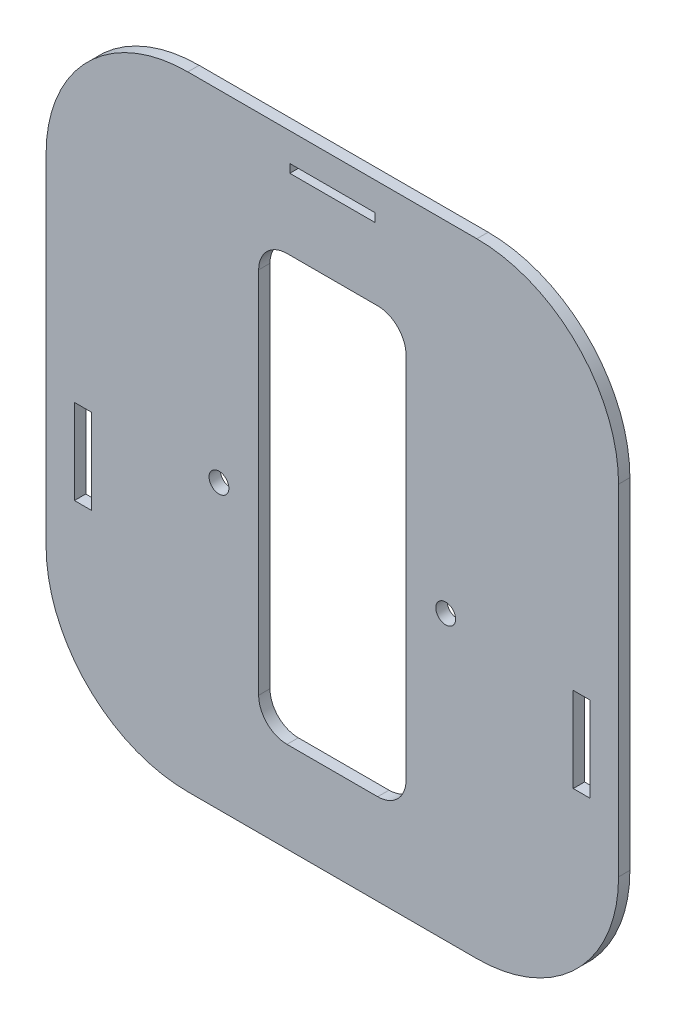
ISO-10303-21;
HEADER;
FILE_DESCRIPTION(('STEP AP214'),'2;1');
FILE_NAME('part.step','',(''),(''),'','','');
FILE_SCHEMA(('AUTOMOTIVE_DESIGN { 1 0 10303 214 1 1 1 1 }'));
ENDSEC;
DATA;
#1=APPLICATION_CONTEXT('core data for automotive mechanical design processes');
#2=APPLICATION_PROTOCOL_DEFINITION('international standard','automotive_design',2000,#1);
#3=PRODUCT_CONTEXT('',#1,'mechanical');
#4=PRODUCT('Part','Part','',(#3));
#5=PRODUCT_RELATED_PRODUCT_CATEGORY('part','',(#4));
#6=PRODUCT_DEFINITION_FORMATION('','',#4);
#7=PRODUCT_DEFINITION_CONTEXT('part definition',#1,'design');
#8=PRODUCT_DEFINITION('design','',#6,#7);
#9=PRODUCT_DEFINITION_SHAPE('','',#8);
#10=(LENGTH_UNIT() NAMED_UNIT(*) SI_UNIT(.MILLI.,.METRE.));
#11=(NAMED_UNIT(*) PLANE_ANGLE_UNIT() SI_UNIT($,.RADIAN.));
#12=(NAMED_UNIT(*) SI_UNIT($,.STERADIAN.) SOLID_ANGLE_UNIT());
#13=UNCERTAINTY_MEASURE_WITH_UNIT(LENGTH_MEASURE(1.E-05),#10,'distance_accuracy_value','');
#14=(GEOMETRIC_REPRESENTATION_CONTEXT(3) GLOBAL_UNCERTAINTY_ASSIGNED_CONTEXT((#13)) GLOBAL_UNIT_ASSIGNED_CONTEXT((#10,
#11,#12)) REPRESENTATION_CONTEXT('',''));
#15=CARTESIAN_POINT('',(0.,0.,0.));
#16=DIRECTION('',(0.,0.,1.));
#17=DIRECTION('',(1.,0.,0.));
#18=AXIS2_PLACEMENT_3D('',#15,#16,#17);
#19=CARTESIAN_POINT('',(-8.,87.1,2.));
#20=DIRECTION('',(1.,0.,0.));
#21=DIRECTION('',(0.,1.,0.));
#22=AXIS2_PLACEMENT_3D('',#19,#20,#21);
#23=PLANE('',#22);
#24=DIRECTION('',(0.,-1.,0.));
#25=VECTOR('',#24,1.);
#26=CARTESIAN_POINT('',(-8.,87.1,0.));
#27=LINE('',#26,#25);
#28=CARTESIAN_POINT('',(-8.,62.1,0.));
#29=VERTEX_POINT('',#28);
#30=CARTESIAN_POINT('',(-7.99999999999999,2.09999999999999,0.));
#31=VERTEX_POINT('',#30);
#32=EDGE_CURVE('E326',#29,#31,#27,.T.);
#33=ORIENTED_EDGE('',*,*,#32,.T.);
#34=DIRECTION('',(0.,0.,-1.));
#35=VECTOR('',#34,1.);
#36=CARTESIAN_POINT('',(-7.99999999999999,2.09999999999999,2.));
#37=LINE('',#36,#35);
#38=CARTESIAN_POINT('',(-7.99999999999999,2.09999999999999,2.));
#39=VERTEX_POINT('',#38);
#40=EDGE_CURVE('E390',#31,#39,#37,.F.);
#41=ORIENTED_EDGE('',*,*,#40,.T.);
#42=DIRECTION('',(0.,-1.,0.));
#43=VECTOR('',#42,1.);
#44=CARTESIAN_POINT('',(-8.,87.1,2.));
#45=LINE('',#44,#43);
#46=CARTESIAN_POINT('',(-8.,62.1,2.));
#47=VERTEX_POINT('',#46);
#48=EDGE_CURVE('E333',#47,#39,#45,.T.);
#49=ORIENTED_EDGE('',*,*,#48,.F.);
#50=DIRECTION('',(0.,0.,-1.));
#51=VECTOR('',#50,1.);
#52=CARTESIAN_POINT('',(-8.,62.1,2.));
#53=LINE('',#52,#51);
#54=EDGE_CURVE('E387',#47,#29,#53,.T.);
#55=ORIENTED_EDGE('',*,*,#54,.T.);
#56=EDGE_LOOP('',(#33,#41,#49,#55));
#57=FACE_BOUND('',#56,.T.);
#58=ADVANCED_FACE('F33',(#57),#23,.F.);
#59=CARTESIAN_POINT('',(-7.99999999999998,-22.9,2.));
#60=DIRECTION('',(0.,1.,0.));
#61=DIRECTION('',(0.,0.,1.));
#62=AXIS2_PLACEMENT_3D('',#59,#60,#61);
#63=PLANE('',#62);
#64=DIRECTION('',(1.,0.,0.));
#65=VECTOR('',#64,1.);
#66=CARTESIAN_POINT('',(-7.99999999999998,-22.9,0.));
#67=LINE('',#66,#65);
#68=CARTESIAN_POINT('',(17.,-22.9,0.));
#69=VERTEX_POINT('',#68);
#70=CARTESIAN_POINT('',(68.,-22.9,0.));
#71=VERTEX_POINT('',#70);
#72=EDGE_CURVE('E349',#69,#71,#67,.T.);
#73=ORIENTED_EDGE('',*,*,#72,.T.);
#74=DIRECTION('',(0.,0.,-1.));
#75=VECTOR('',#74,1.);
#76=CARTESIAN_POINT('',(68.,-22.9,2.));
#77=LINE('',#76,#75);
#78=CARTESIAN_POINT('',(68.,-22.9,2.));
#79=VERTEX_POINT('',#78);
#80=EDGE_CURVE('E385',#71,#79,#77,.F.);
#81=ORIENTED_EDGE('',*,*,#80,.T.);
#82=DIRECTION('',(1.,0.,0.));
#83=VECTOR('',#82,1.);
#84=CARTESIAN_POINT('',(-7.99999999999998,-22.9,2.));
#85=LINE('',#84,#83);
#86=CARTESIAN_POINT('',(17.,-22.9,2.));
#87=VERTEX_POINT('',#86);
#88=EDGE_CURVE('E336',#87,#79,#85,.T.);
#89=ORIENTED_EDGE('',*,*,#88,.F.);
#90=DIRECTION('',(0.,0.,-1.));
#91=VECTOR('',#90,1.);
#92=CARTESIAN_POINT('',(17.,-22.9,2.));
#93=LINE('',#92,#91);
#94=EDGE_CURVE('E382',#87,#69,#93,.T.);
#95=ORIENTED_EDGE('',*,*,#94,.T.);
#96=EDGE_LOOP('',(#73,#81,#89,#95));
#97=FACE_BOUND('',#96,.T.);
#98=ADVANCED_FACE('F529',(#97),#63,.F.);
#99=CARTESIAN_POINT('',(93.,87.1,2.));
#100=DIRECTION('',(-1.,0.,0.));
#101=DIRECTION('',(0.,-1.,0.));
#102=AXIS2_PLACEMENT_3D('',#99,#100,#101);
#103=PLANE('',#102);
#104=DIRECTION('',(0.,1.,0.));
#105=VECTOR('',#104,1.);
#106=CARTESIAN_POINT('',(93.,87.1,0.));
#107=LINE('',#106,#105);
#108=CARTESIAN_POINT('',(93.,2.1,0.));
#109=VERTEX_POINT('',#108);
#110=CARTESIAN_POINT('',(93.,62.1,0.));
#111=VERTEX_POINT('',#110);
#112=EDGE_CURVE('E352',#109,#111,#107,.T.);
#113=ORIENTED_EDGE('',*,*,#112,.T.);
#114=DIRECTION('',(0.,0.,-1.));
#115=VECTOR('',#114,1.);
#116=CARTESIAN_POINT('',(93.,62.1,2.));
#117=LINE('',#116,#115);
#118=CARTESIAN_POINT('',(93.,62.1,2.));
#119=VERTEX_POINT('',#118);
#120=EDGE_CURVE('E372',#111,#119,#117,.F.);
#121=ORIENTED_EDGE('',*,*,#120,.T.);
#122=DIRECTION('',(0.,1.,0.));
#123=VECTOR('',#122,1.);
#124=CARTESIAN_POINT('',(93.,87.1,2.));
#125=LINE('',#124,#123);
#126=CARTESIAN_POINT('',(93.,2.1,2.));
#127=VERTEX_POINT('',#126);
#128=EDGE_CURVE('E340',#127,#119,#125,.T.);
#129=ORIENTED_EDGE('',*,*,#128,.F.);
#130=DIRECTION('',(0.,0.,-1.));
#131=VECTOR('',#130,1.);
#132=CARTESIAN_POINT('',(93.,2.1,2.));
#133=LINE('',#132,#131);
#134=EDGE_CURVE('E369',#127,#109,#133,.T.);
#135=ORIENTED_EDGE('',*,*,#134,.T.);
#136=EDGE_LOOP('',(#113,#121,#129,#135));
#137=FACE_BOUND('',#136,.T.);
#138=ADVANCED_FACE('F533',(#137),#103,.F.);
#139=CARTESIAN_POINT('',(-8.,87.1,2.));
#140=DIRECTION('',(0.,-1.,0.));
#141=DIRECTION('',(0.,0.,-1.));
#142=AXIS2_PLACEMENT_3D('',#139,#140,#141);
#143=PLANE('',#142);
#144=DIRECTION('',(-1.,0.,0.));
#145=VECTOR('',#144,1.);
#146=CARTESIAN_POINT('',(-8.,87.1,2.));
#147=LINE('',#146,#145);
#148=CARTESIAN_POINT('',(68.,87.1,2.));
#149=VERTEX_POINT('',#148);
#150=CARTESIAN_POINT('',(17.,87.1,2.));
#151=VERTEX_POINT('',#150);
#152=EDGE_CURVE('E343',#149,#151,#147,.T.);
#153=ORIENTED_EDGE('',*,*,#152,.F.);
#154=DIRECTION('',(0.,0.,-1.));
#155=VECTOR('',#154,1.);
#156=CARTESIAN_POINT('',(68.,87.1,2.));
#157=LINE('',#156,#155);
#158=CARTESIAN_POINT('',(68.,87.1,0.));
#159=VERTEX_POINT('',#158);
#160=EDGE_CURVE('E358',#149,#159,#157,.T.);
#161=ORIENTED_EDGE('',*,*,#160,.T.);
#162=DIRECTION('',(-1.,0.,0.));
#163=VECTOR('',#162,1.);
#164=CARTESIAN_POINT('',(-8.,87.1,0.));
#165=LINE('',#164,#163);
#166=CARTESIAN_POINT('',(17.,87.1,0.));
#167=VERTEX_POINT('',#166);
#168=EDGE_CURVE('E337',#159,#167,#165,.T.);
#169=ORIENTED_EDGE('',*,*,#168,.T.);
#170=DIRECTION('',(0.,0.,-1.));
#171=VECTOR('',#170,1.);
#172=CARTESIAN_POINT('',(17.,87.1,2.));
#173=LINE('',#172,#171);
#174=EDGE_CURVE('E346',#167,#151,#173,.F.);
#175=ORIENTED_EDGE('',*,*,#174,.T.);
#176=EDGE_LOOP('',(#153,#161,#169,#175));
#177=FACE_BOUND('',#176,.T.);
#178=ADVANCED_FACE('F486',(#177),#143,.F.);
#179=CARTESIAN_POINT('',(0.,0.,2.));
#180=DIRECTION('',(0.,0.,1.));
#181=DIRECTION('',(1.,0.,0.));
#182=AXIS2_PLACEMENT_3D('',#179,#180,#181);
#183=PLANE('',#182);
#184=CARTESIAN_POINT('',(62.5,27.1,2.));
#185=DIRECTION('',(0.,0.,1.));
#186=DIRECTION('',(1.,0.,0.));
#187=AXIS2_PLACEMENT_3D('',#184,#185,#186);
#188=CIRCLE('',#187,1.75);
#189=CARTESIAN_POINT('',(64.25,27.1,2.));
#190=VERTEX_POINT('',#189);
#191=EDGE_CURVE('E436',#190,#190,#188,.T.);
#192=ORIENTED_EDGE('',*,*,#191,.F.);
#193=EDGE_LOOP('',(#192));
#194=FACE_BOUND('',#193,.T.);
#195=CARTESIAN_POINT('',(22.5,27.1,2.));
#196=DIRECTION('',(0.,0.,1.));
#197=DIRECTION('',(1.,0.,0.));
#198=AXIS2_PLACEMENT_3D('',#195,#196,#197);
#199=CIRCLE('',#198,1.75);
#200=CARTESIAN_POINT('',(24.25,27.1,2.));
#201=VERTEX_POINT('',#200);
#202=EDGE_CURVE('E425',#201,#201,#199,.T.);
#203=ORIENTED_EDGE('',*,*,#202,.F.);
#204=EDGE_LOOP('',(#203));
#205=FACE_BOUND('',#204,.T.);
#206=DIRECTION('',(0.,-1.,0.));
#207=VECTOR('',#206,1.);
#208=CARTESIAN_POINT('',(29.5,68.1,2.));
#209=LINE('',#208,#207);
#210=CARTESIAN_POINT('',(29.5,63.1,2.));
#211=VERTEX_POINT('',#210);
#212=CARTESIAN_POINT('',(29.5,-1.9,2.));
#213=VERTEX_POINT('',#212);
#214=EDGE_CURVE('E424',#211,#213,#209,.T.);
#215=ORIENTED_EDGE('',*,*,#214,.F.);
#216=CARTESIAN_POINT('',(34.5,63.1,2.));
#217=DIRECTION('',(0.,0.,1.));
#218=DIRECTION('',(1.,0.,0.));
#219=AXIS2_PLACEMENT_3D('',#216,#217,#218);
#220=CIRCLE('',#219,5.);
#221=CARTESIAN_POINT('',(34.5,68.1,2.));
#222=VERTEX_POINT('',#221);
#223=EDGE_CURVE('E42',#211,#222,#220,.F.);
#224=ORIENTED_EDGE('',*,*,#223,.T.);
#225=DIRECTION('',(-1.,0.,0.));
#226=VECTOR('',#225,1.);
#227=CARTESIAN_POINT('',(29.5,68.1,2.));
#228=LINE('',#227,#226);
#229=CARTESIAN_POINT('',(50.5,68.1,2.));
#230=VERTEX_POINT('',#229);
#231=EDGE_CURVE('E252',#230,#222,#228,.T.);
#232=ORIENTED_EDGE('',*,*,#231,.F.);
#233=CARTESIAN_POINT('',(50.5,63.1,2.));
#234=DIRECTION('',(0.,0.,1.));
#235=DIRECTION('',(1.,0.,0.));
#236=AXIS2_PLACEMENT_3D('',#233,#234,#235);
#237=CIRCLE('',#236,5.);
#238=CARTESIAN_POINT('',(55.5,63.1,2.));
#239=VERTEX_POINT('',#238);
#240=EDGE_CURVE('E419',#230,#239,#237,.F.);
#241=ORIENTED_EDGE('',*,*,#240,.T.);
#242=DIRECTION('',(0.,1.,0.));
#243=VECTOR('',#242,1.);
#244=CARTESIAN_POINT('',(55.5,68.1,2.));
#245=LINE('',#244,#243);
#246=CARTESIAN_POINT('',(55.5,-1.9,2.));
#247=VERTEX_POINT('',#246);
#248=EDGE_CURVE('E449',#247,#239,#245,.T.);
#249=ORIENTED_EDGE('',*,*,#248,.F.);
#250=CARTESIAN_POINT('',(50.5,-1.9,2.));
#251=DIRECTION('',(0.,0.,1.));
#252=DIRECTION('',(1.,0.,0.));
#253=AXIS2_PLACEMENT_3D('',#250,#251,#252);
#254=CIRCLE('',#253,5.);
#255=CARTESIAN_POINT('',(50.5,-6.9,2.));
#256=VERTEX_POINT('',#255);
#257=EDGE_CURVE('E415',#247,#256,#254,.F.);
#258=ORIENTED_EDGE('',*,*,#257,.T.);
#259=DIRECTION('',(1.,0.,0.));
#260=VECTOR('',#259,1.);
#261=CARTESIAN_POINT('',(29.5,-6.9,2.));
#262=LINE('',#261,#260);
#263=CARTESIAN_POINT('',(34.5,-6.9,2.));
#264=VERTEX_POINT('',#263);
#265=EDGE_CURVE('E429',#264,#256,#262,.T.);
#266=ORIENTED_EDGE('',*,*,#265,.F.);
#267=CARTESIAN_POINT('',(34.5,-1.9,2.));
#268=DIRECTION('',(0.,0.,1.));
#269=DIRECTION('',(1.,0.,0.));
#270=AXIS2_PLACEMENT_3D('',#267,#268,#269);
#271=CIRCLE('',#270,5.);
#272=EDGE_CURVE('E411',#264,#213,#271,.F.);
#273=ORIENTED_EDGE('',*,*,#272,.T.);
#274=EDGE_LOOP('',(#215,#224,#232,#241,#249,#258,#266,#273));
#275=FACE_BOUND('',#274,.T.);
#276=DIRECTION('',(0.,-1.,0.));
#277=VECTOR('',#276,1.);
#278=CARTESIAN_POINT('',(85.,26.6,2.));
#279=LINE('',#278,#277);
#280=CARTESIAN_POINT('',(85.,26.6,2.));
#281=VERTEX_POINT('',#280);
#282=CARTESIAN_POINT('',(85.,11.6,2.));
#283=VERTEX_POINT('',#282);
#284=EDGE_CURVE('E228',#281,#283,#279,.T.);
#285=ORIENTED_EDGE('',*,*,#284,.F.);
#286=DIRECTION('',(-1.,0.,0.));
#287=VECTOR('',#286,1.);
#288=CARTESIAN_POINT('',(85.,26.6,2.));
#289=LINE('',#288,#287);
#290=CARTESIAN_POINT('',(88.,26.6,2.));
#291=VERTEX_POINT('',#290);
#292=EDGE_CURVE('E246',#291,#281,#289,.T.);
#293=ORIENTED_EDGE('',*,*,#292,.F.);
#294=DIRECTION('',(0.,1.,0.));
#295=VECTOR('',#294,1.);
#296=CARTESIAN_POINT('',(88.,26.6,2.));
#297=LINE('',#296,#295);
#298=CARTESIAN_POINT('',(88.,11.6,2.));
#299=VERTEX_POINT('',#298);
#300=EDGE_CURVE('E249',#299,#291,#297,.T.);
#301=ORIENTED_EDGE('',*,*,#300,.F.);
#302=DIRECTION('',(1.,0.,0.));
#303=VECTOR('',#302,1.);
#304=CARTESIAN_POINT('',(85.,11.6,2.));
#305=LINE('',#304,#303);
#306=EDGE_CURVE('E258',#283,#299,#305,.T.);
#307=ORIENTED_EDGE('',*,*,#306,.F.);
#308=EDGE_LOOP('',(#285,#293,#301,#307));
#309=FACE_BOUND('',#308,.T.);
#310=DIRECTION('',(0.,-1.,0.));
#311=VECTOR('',#310,1.);
#312=CARTESIAN_POINT('',(-3.,26.6,2.));
#313=LINE('',#312,#311);
#314=CARTESIAN_POINT('',(-3.,26.6,2.));
#315=VERTEX_POINT('',#314);
#316=CARTESIAN_POINT('',(-3.,11.6,2.));
#317=VERTEX_POINT('',#316);
#318=EDGE_CURVE('E265',#315,#317,#313,.T.);
#319=ORIENTED_EDGE('',*,*,#318,.F.);
#320=DIRECTION('',(-1.,0.,0.));
#321=VECTOR('',#320,1.);
#322=CARTESIAN_POINT('',(-3.,26.6,2.));
#323=LINE('',#322,#321);
#324=CARTESIAN_POINT('',(0.,26.6,2.));
#325=VERTEX_POINT('',#324);
#326=EDGE_CURVE('E273',#325,#315,#323,.T.);
#327=ORIENTED_EDGE('',*,*,#326,.F.);
#328=DIRECTION('',(0.,1.,0.));
#329=VECTOR('',#328,1.);
#330=CARTESIAN_POINT('',(0.,26.6,2.));
#331=LINE('',#330,#329);
#332=CARTESIAN_POINT('',(0.,11.6,2.));
#333=VERTEX_POINT('',#332);
#334=EDGE_CURVE('E287',#333,#325,#331,.T.);
#335=ORIENTED_EDGE('',*,*,#334,.F.);
#336=DIRECTION('',(1.,0.,0.));
#337=VECTOR('',#336,1.);
#338=CARTESIAN_POINT('',(-3.,11.6,2.));
#339=LINE('',#338,#337);
#340=EDGE_CURVE('E284',#317,#333,#339,.T.);
#341=ORIENTED_EDGE('',*,*,#340,.F.);
#342=EDGE_LOOP('',(#319,#327,#335,#341));
#343=FACE_BOUND('',#342,.T.);
#344=DIRECTION('',(0.,-1.,0.));
#345=VECTOR('',#344,1.);
#346=CARTESIAN_POINT('',(35.,82.1,2.));
#347=LINE('',#346,#345);
#348=CARTESIAN_POINT('',(35.,82.1,2.));
#349=VERTEX_POINT('',#348);
#350=CARTESIAN_POINT('',(35.,80.6,2.));
#351=VERTEX_POINT('',#350);
#352=EDGE_CURVE('E294',#349,#351,#347,.T.);
#353=ORIENTED_EDGE('',*,*,#352,.F.);
#354=DIRECTION('',(-1.,0.,0.));
#355=VECTOR('',#354,1.);
#356=CARTESIAN_POINT('',(35.,82.1,2.));
#357=LINE('',#356,#355);
#358=CARTESIAN_POINT('',(50.,82.1,2.));
#359=VERTEX_POINT('',#358);
#360=EDGE_CURVE('E305',#359,#349,#357,.T.);
#361=ORIENTED_EDGE('',*,*,#360,.F.);
#362=DIRECTION('',(0.,1.,0.));
#363=VECTOR('',#362,1.);
#364=CARTESIAN_POINT('',(50.,82.1,2.));
#365=LINE('',#364,#363);
#366=CARTESIAN_POINT('',(50.,80.6,2.));
#367=VERTEX_POINT('',#366);
#368=EDGE_CURVE('E319',#367,#359,#365,.T.);
#369=ORIENTED_EDGE('',*,*,#368,.F.);
#370=DIRECTION('',(1.,0.,0.));
#371=VECTOR('',#370,1.);
#372=CARTESIAN_POINT('',(35.,80.6,2.));
#373=LINE('',#372,#371);
#374=EDGE_CURVE('E316',#351,#367,#373,.T.);
#375=ORIENTED_EDGE('',*,*,#374,.F.);
#376=EDGE_LOOP('',(#353,#361,#369,#375));
#377=FACE_BOUND('',#376,.T.);
#378=ORIENTED_EDGE('',*,*,#128,.T.);
#379=CARTESIAN_POINT('',(68.,62.1,2.));
#380=DIRECTION('',(0.,0.,1.));
#381=DIRECTION('',(1.,0.,0.));
#382=AXIS2_PLACEMENT_3D('',#379,#380,#381);
#383=CIRCLE('',#382,25.);
#384=EDGE_CURVE('E380',#119,#149,#383,.T.);
#385=ORIENTED_EDGE('',*,*,#384,.T.);
#386=ORIENTED_EDGE('',*,*,#152,.T.);
#387=CARTESIAN_POINT('',(17.,62.1,2.));
#388=DIRECTION('',(0.,0.,1.));
#389=DIRECTION('',(1.,0.,0.));
#390=AXIS2_PLACEMENT_3D('',#387,#388,#389);
#391=CIRCLE('',#390,25.);
#392=EDGE_CURVE('E374',#151,#47,#391,.T.);
#393=ORIENTED_EDGE('',*,*,#392,.T.);
#394=ORIENTED_EDGE('',*,*,#48,.T.);
#395=CARTESIAN_POINT('',(17.,2.1,2.));
#396=DIRECTION('',(0.,0.,1.));
#397=DIRECTION('',(1.,0.,0.));
#398=AXIS2_PLACEMENT_3D('',#395,#396,#397);
#399=CIRCLE('',#398,25.);
#400=EDGE_CURVE('E376',#39,#87,#399,.T.);
#401=ORIENTED_EDGE('',*,*,#400,.T.);
#402=ORIENTED_EDGE('',*,*,#88,.T.);
#403=CARTESIAN_POINT('',(68.,2.1,2.));
#404=DIRECTION('',(0.,0.,1.));
#405=DIRECTION('',(1.,0.,0.));
#406=AXIS2_PLACEMENT_3D('',#403,#404,#405);
#407=CIRCLE('',#406,25.);
#408=EDGE_CURVE('E378',#79,#127,#407,.T.);
#409=ORIENTED_EDGE('',*,*,#408,.T.);
#410=EDGE_LOOP('',(#378,#385,#386,#393,#394,#401,#402,#409));
#411=FACE_BOUND('',#410,.T.);
#412=ADVANCED_FACE('F483',(#194,#205,#275,#309,#343,#377,#411),#183,.T.);
#413=CARTESIAN_POINT('',(0.,0.,0.));
#414=DIRECTION('',(0.,0.,1.));
#415=DIRECTION('',(1.,0.,0.));
#416=AXIS2_PLACEMENT_3D('',#413,#414,#415);
#417=PLANE('',#416);
#418=CARTESIAN_POINT('',(62.5,27.1,0.));
#419=DIRECTION('',(0.,0.,1.));
#420=DIRECTION('',(1.,0.,0.));
#421=AXIS2_PLACEMENT_3D('',#418,#419,#420);
#422=CIRCLE('',#421,1.75);
#423=CARTESIAN_POINT('',(64.25,27.1,0.));
#424=VERTEX_POINT('',#423);
#425=EDGE_CURVE('E37',#424,#424,#422,.T.);
#426=ORIENTED_EDGE('',*,*,#425,.T.);
#427=EDGE_LOOP('',(#426));
#428=FACE_BOUND('',#427,.T.);
#429=CARTESIAN_POINT('',(22.5,27.1,0.));
#430=DIRECTION('',(0.,0.,1.));
#431=DIRECTION('',(1.,0.,0.));
#432=AXIS2_PLACEMENT_3D('',#429,#430,#431);
#433=CIRCLE('',#432,1.75);
#434=CARTESIAN_POINT('',(24.25,27.1,0.));
#435=VERTEX_POINT('',#434);
#436=EDGE_CURVE('E422',#435,#435,#433,.T.);
#437=ORIENTED_EDGE('',*,*,#436,.T.);
#438=EDGE_LOOP('',(#437));
#439=FACE_BOUND('',#438,.T.);
#440=DIRECTION('',(0.,1.,0.));
#441=VECTOR('',#440,1.);
#442=CARTESIAN_POINT('',(55.5,68.1,0.));
#443=LINE('',#442,#441);
#444=CARTESIAN_POINT('',(55.5,-1.9,0.));
#445=VERTEX_POINT('',#444);
#446=CARTESIAN_POINT('',(55.5,63.1,0.));
#447=VERTEX_POINT('',#446);
#448=EDGE_CURVE('E445',#445,#447,#443,.T.);
#449=ORIENTED_EDGE('',*,*,#448,.T.);
#450=CARTESIAN_POINT('',(50.5,63.1,0.));
#451=DIRECTION('',(0.,0.,1.));
#452=DIRECTION('',(1.,0.,0.));
#453=AXIS2_PLACEMENT_3D('',#450,#451,#452);
#454=CIRCLE('',#453,5.);
#455=CARTESIAN_POINT('',(50.5,68.1,0.));
#456=VERTEX_POINT('',#455);
#457=EDGE_CURVE('E57',#447,#456,#454,.T.);
#458=ORIENTED_EDGE('',*,*,#457,.T.);
#459=DIRECTION('',(-1.,0.,0.));
#460=VECTOR('',#459,1.);
#461=CARTESIAN_POINT('',(29.5,68.1,0.));
#462=LINE('',#461,#460);
#463=CARTESIAN_POINT('',(34.5,68.1,0.));
#464=VERTEX_POINT('',#463);
#465=EDGE_CURVE('E259',#456,#464,#462,.T.);
#466=ORIENTED_EDGE('',*,*,#465,.T.);
#467=CARTESIAN_POINT('',(34.5,63.1,0.));
#468=DIRECTION('',(0.,0.,1.));
#469=DIRECTION('',(1.,0.,0.));
#470=AXIS2_PLACEMENT_3D('',#467,#468,#469);
#471=CIRCLE('',#470,5.);
#472=CARTESIAN_POINT('',(29.5,63.1,0.));
#473=VERTEX_POINT('',#472);
#474=EDGE_CURVE('E11',#464,#473,#471,.T.);
#475=ORIENTED_EDGE('',*,*,#474,.T.);
#476=DIRECTION('',(0.,-1.,0.));
#477=VECTOR('',#476,1.);
#478=CARTESIAN_POINT('',(29.5,68.1,0.));
#479=LINE('',#478,#477);
#480=CARTESIAN_POINT('',(29.5,-1.9,0.));
#481=VERTEX_POINT('',#480);
#482=EDGE_CURVE('E439',#473,#481,#479,.T.);
#483=ORIENTED_EDGE('',*,*,#482,.T.);
#484=CARTESIAN_POINT('',(34.5,-1.9,0.));
#485=DIRECTION('',(0.,0.,1.));
#486=DIRECTION('',(1.,0.,0.));
#487=AXIS2_PLACEMENT_3D('',#484,#485,#486);
#488=CIRCLE('',#487,5.);
#489=CARTESIAN_POINT('',(34.5,-6.9,0.));
#490=VERTEX_POINT('',#489);
#491=EDGE_CURVE('E413',#481,#490,#488,.T.);
#492=ORIENTED_EDGE('',*,*,#491,.T.);
#493=DIRECTION('',(1.,0.,0.));
#494=VECTOR('',#493,1.);
#495=CARTESIAN_POINT('',(29.5,-6.9,0.));
#496=LINE('',#495,#494);
#497=CARTESIAN_POINT('',(50.5,-6.9,0.));
#498=VERTEX_POINT('',#497);
#499=EDGE_CURVE('E442',#490,#498,#496,.T.);
#500=ORIENTED_EDGE('',*,*,#499,.T.);
#501=CARTESIAN_POINT('',(50.5,-1.9,0.));
#502=DIRECTION('',(0.,0.,1.));
#503=DIRECTION('',(1.,0.,0.));
#504=AXIS2_PLACEMENT_3D('',#501,#502,#503);
#505=CIRCLE('',#504,5.);
#506=EDGE_CURVE('E417',#498,#445,#505,.T.);
#507=ORIENTED_EDGE('',*,*,#506,.T.);
#508=EDGE_LOOP('',(#449,#458,#466,#475,#483,#492,#500,#507));
#509=FACE_BOUND('',#508,.T.);
#510=DIRECTION('',(-1.,0.,0.));
#511=VECTOR('',#510,1.);
#512=CARTESIAN_POINT('',(85.,26.6,0.));
#513=LINE('',#512,#511);
#514=CARTESIAN_POINT('',(88.,26.6,0.));
#515=VERTEX_POINT('',#514);
#516=CARTESIAN_POINT('',(85.,26.6,0.));
#517=VERTEX_POINT('',#516);
#518=EDGE_CURVE('E233',#515,#517,#513,.T.);
#519=ORIENTED_EDGE('',*,*,#518,.T.);
#520=DIRECTION('',(0.,-1.,0.));
#521=VECTOR('',#520,1.);
#522=CARTESIAN_POINT('',(85.,26.6,0.));
#523=LINE('',#522,#521);
#524=CARTESIAN_POINT('',(85.,11.6,0.));
#525=VERTEX_POINT('',#524);
#526=EDGE_CURVE('E225',#517,#525,#523,.T.);
#527=ORIENTED_EDGE('',*,*,#526,.T.);
#528=DIRECTION('',(1.,0.,0.));
#529=VECTOR('',#528,1.);
#530=CARTESIAN_POINT('',(85.,11.6,0.));
#531=LINE('',#530,#529);
#532=CARTESIAN_POINT('',(88.,11.6,0.));
#533=VERTEX_POINT('',#532);
#534=EDGE_CURVE('E237',#525,#533,#531,.T.);
#535=ORIENTED_EDGE('',*,*,#534,.T.);
#536=DIRECTION('',(0.,1.,0.));
#537=VECTOR('',#536,1.);
#538=CARTESIAN_POINT('',(88.,26.6,0.));
#539=LINE('',#538,#537);
#540=EDGE_CURVE('E241',#533,#515,#539,.T.);
#541=ORIENTED_EDGE('',*,*,#540,.T.);
#542=EDGE_LOOP('',(#519,#527,#535,#541));
#543=FACE_BOUND('',#542,.T.);
#544=DIRECTION('',(-1.,0.,0.));
#545=VECTOR('',#544,1.);
#546=CARTESIAN_POINT('',(-3.,26.6,0.));
#547=LINE('',#546,#545);
#548=CARTESIAN_POINT('',(0.,26.6,0.));
#549=VERTEX_POINT('',#548);
#550=CARTESIAN_POINT('',(-3.,26.6,0.));
#551=VERTEX_POINT('',#550);
#552=EDGE_CURVE('E279',#549,#551,#547,.T.);
#553=ORIENTED_EDGE('',*,*,#552,.T.);
#554=DIRECTION('',(0.,-1.,0.));
#555=VECTOR('',#554,1.);
#556=CARTESIAN_POINT('',(-3.,26.6,0.));
#557=LINE('',#556,#555);
#558=CARTESIAN_POINT('',(-3.,11.6,0.));
#559=VERTEX_POINT('',#558);
#560=EDGE_CURVE('E269',#551,#559,#557,.T.);
#561=ORIENTED_EDGE('',*,*,#560,.T.);
#562=DIRECTION('',(1.,0.,0.));
#563=VECTOR('',#562,1.);
#564=CARTESIAN_POINT('',(-3.,11.6,0.));
#565=LINE('',#564,#563);
#566=CARTESIAN_POINT('',(0.,11.6,0.));
#567=VERTEX_POINT('',#566);
#568=EDGE_CURVE('E272',#559,#567,#565,.T.);
#569=ORIENTED_EDGE('',*,*,#568,.T.);
#570=DIRECTION('',(0.,1.,0.));
#571=VECTOR('',#570,1.);
#572=CARTESIAN_POINT('',(0.,26.6,0.));
#573=LINE('',#572,#571);
#574=EDGE_CURVE('E276',#567,#549,#573,.T.);
#575=ORIENTED_EDGE('',*,*,#574,.T.);
#576=EDGE_LOOP('',(#553,#561,#569,#575));
#577=FACE_BOUND('',#576,.T.);
#578=DIRECTION('',(-1.,0.,0.));
#579=VECTOR('',#578,1.);
#580=CARTESIAN_POINT('',(35.,82.1,0.));
#581=LINE('',#580,#579);
#582=CARTESIAN_POINT('',(50.,82.1,0.));
#583=VERTEX_POINT('',#582);
#584=CARTESIAN_POINT('',(35.,82.1,0.));
#585=VERTEX_POINT('',#584);
#586=EDGE_CURVE('E311',#583,#585,#581,.T.);
#587=ORIENTED_EDGE('',*,*,#586,.T.);
#588=DIRECTION('',(0.,-1.,0.));
#589=VECTOR('',#588,1.);
#590=CARTESIAN_POINT('',(35.,82.1,0.));
#591=LINE('',#590,#589);
#592=CARTESIAN_POINT('',(35.,80.6,0.));
#593=VERTEX_POINT('',#592);
#594=EDGE_CURVE('E301',#585,#593,#591,.T.);
#595=ORIENTED_EDGE('',*,*,#594,.T.);
#596=DIRECTION('',(1.,0.,0.));
#597=VECTOR('',#596,1.);
#598=CARTESIAN_POINT('',(35.,80.6,0.));
#599=LINE('',#598,#597);
#600=CARTESIAN_POINT('',(50.,80.6,0.));
#601=VERTEX_POINT('',#600);
#602=EDGE_CURVE('E304',#593,#601,#599,.T.);
#603=ORIENTED_EDGE('',*,*,#602,.T.);
#604=DIRECTION('',(0.,1.,0.));
#605=VECTOR('',#604,1.);
#606=CARTESIAN_POINT('',(50.,82.1,0.));
#607=LINE('',#606,#605);
#608=EDGE_CURVE('E308',#601,#583,#607,.T.);
#609=ORIENTED_EDGE('',*,*,#608,.T.);
#610=EDGE_LOOP('',(#587,#595,#603,#609));
#611=FACE_BOUND('',#610,.T.);
#612=ORIENTED_EDGE('',*,*,#168,.F.);
#613=CARTESIAN_POINT('',(68.,62.1,0.));
#614=DIRECTION('',(0.,0.,1.));
#615=DIRECTION('',(1.,0.,0.));
#616=AXIS2_PLACEMENT_3D('',#613,#614,#615);
#617=CIRCLE('',#616,25.);
#618=EDGE_CURVE('E367',#159,#111,#617,.F.);
#619=ORIENTED_EDGE('',*,*,#618,.T.);
#620=ORIENTED_EDGE('',*,*,#112,.F.);
#621=CARTESIAN_POINT('',(68.,2.1,0.));
#622=DIRECTION('',(0.,0.,1.));
#623=DIRECTION('',(1.,0.,0.));
#624=AXIS2_PLACEMENT_3D('',#621,#622,#623);
#625=CIRCLE('',#624,25.);
#626=EDGE_CURVE('E365',#109,#71,#625,.F.);
#627=ORIENTED_EDGE('',*,*,#626,.T.);
#628=ORIENTED_EDGE('',*,*,#72,.F.);
#629=CARTESIAN_POINT('',(17.,2.1,0.));
#630=DIRECTION('',(0.,0.,1.));
#631=DIRECTION('',(1.,0.,0.));
#632=AXIS2_PLACEMENT_3D('',#629,#630,#631);
#633=CIRCLE('',#632,25.);
#634=EDGE_CURVE('E363',#69,#31,#633,.F.);
#635=ORIENTED_EDGE('',*,*,#634,.T.);
#636=ORIENTED_EDGE('',*,*,#32,.F.);
#637=CARTESIAN_POINT('',(17.,62.1,0.));
#638=DIRECTION('',(0.,0.,1.));
#639=DIRECTION('',(1.,0.,0.));
#640=AXIS2_PLACEMENT_3D('',#637,#638,#639);
#641=CIRCLE('',#640,25.);
#642=EDGE_CURVE('E361',#29,#167,#641,.F.);
#643=ORIENTED_EDGE('',*,*,#642,.T.);
#644=EDGE_LOOP('',(#612,#619,#620,#627,#628,#635,#636,#643));
#645=FACE_BOUND('',#644,.T.);
#646=ADVANCED_FACE('F243',(#428,#439,#509,#543,#577,#611,#645),#417,.F.);
#647=CARTESIAN_POINT('',(35.,82.1,0.));
#648=DIRECTION('',(-1.,0.,0.));
#649=DIRECTION('',(0.,0.,1.));
#650=AXIS2_PLACEMENT_3D('',#647,#648,#649);
#651=PLANE('',#650);
#652=ORIENTED_EDGE('',*,*,#352,.T.);
#653=DIRECTION('',(0.,0.,1.));
#654=VECTOR('',#653,1.);
#655=CARTESIAN_POINT('',(35.,80.6,0.));
#656=LINE('',#655,#654);
#657=EDGE_CURVE('E314',#593,#351,#656,.T.);
#658=ORIENTED_EDGE('',*,*,#657,.F.);
#659=ORIENTED_EDGE('',*,*,#594,.F.);
#660=DIRECTION('',(0.,0.,1.));
#661=VECTOR('',#660,1.);
#662=CARTESIAN_POINT('',(35.,82.1,0.));
#663=LINE('',#662,#661);
#664=EDGE_CURVE('E324',#585,#349,#663,.T.);
#665=ORIENTED_EDGE('',*,*,#664,.T.);
#666=EDGE_LOOP('',(#652,#658,#659,#665));
#667=FACE_BOUND('',#666,.T.);
#668=ADVANCED_FACE('F616',(#667),#651,.F.);
#669=CARTESIAN_POINT('',(35.,82.1,0.));
#670=DIRECTION('',(0.,1.,0.));
#671=DIRECTION('',(0.,0.,1.));
#672=AXIS2_PLACEMENT_3D('',#669,#670,#671);
#673=PLANE('',#672);
#674=ORIENTED_EDGE('',*,*,#360,.T.);
#675=ORIENTED_EDGE('',*,*,#664,.F.);
#676=ORIENTED_EDGE('',*,*,#586,.F.);
#677=DIRECTION('',(0.,0.,1.));
#678=VECTOR('',#677,1.);
#679=CARTESIAN_POINT('',(50.,82.1,0.));
#680=LINE('',#679,#678);
#681=EDGE_CURVE('E327',#583,#359,#680,.T.);
#682=ORIENTED_EDGE('',*,*,#681,.T.);
#683=EDGE_LOOP('',(#674,#675,#676,#682));
#684=FACE_BOUND('',#683,.T.);
#685=ADVANCED_FACE('F612',(#684),#673,.F.);
#686=CARTESIAN_POINT('',(50.,82.1,0.));
#687=DIRECTION('',(1.,0.,0.));
#688=DIRECTION('',(0.,0.,-1.));
#689=AXIS2_PLACEMENT_3D('',#686,#687,#688);
#690=PLANE('',#689);
#691=ORIENTED_EDGE('',*,*,#368,.T.);
#692=ORIENTED_EDGE('',*,*,#681,.F.);
#693=ORIENTED_EDGE('',*,*,#608,.F.);
#694=DIRECTION('',(0.,0.,1.));
#695=VECTOR('',#694,1.);
#696=CARTESIAN_POINT('',(50.,80.6,0.));
#697=LINE('',#696,#695);
#698=EDGE_CURVE('E329',#601,#367,#697,.T.);
#699=ORIENTED_EDGE('',*,*,#698,.T.);
#700=EDGE_LOOP('',(#691,#692,#693,#699));
#701=FACE_BOUND('',#700,.T.);
#702=ADVANCED_FACE('F615',(#701),#690,.F.);
#703=CARTESIAN_POINT('',(35.,80.6,0.));
#704=DIRECTION('',(0.,-1.,0.));
#705=DIRECTION('',(0.,0.,-1.));
#706=AXIS2_PLACEMENT_3D('',#703,#704,#705);
#707=PLANE('',#706);
#708=ORIENTED_EDGE('',*,*,#374,.T.);
#709=ORIENTED_EDGE('',*,*,#698,.F.);
#710=ORIENTED_EDGE('',*,*,#602,.F.);
#711=ORIENTED_EDGE('',*,*,#657,.T.);
#712=EDGE_LOOP('',(#708,#709,#710,#711));
#713=FACE_BOUND('',#712,.T.);
#714=ADVANCED_FACE('F610',(#713),#707,.F.);
#715=CARTESIAN_POINT('',(-3.,26.6,0.));
#716=DIRECTION('',(-1.,0.,0.));
#717=DIRECTION('',(0.,0.,1.));
#718=AXIS2_PLACEMENT_3D('',#715,#716,#717);
#719=PLANE('',#718);
#720=ORIENTED_EDGE('',*,*,#318,.T.);
#721=DIRECTION('',(0.,0.,1.));
#722=VECTOR('',#721,1.);
#723=CARTESIAN_POINT('',(-3.,11.6,0.));
#724=LINE('',#723,#722);
#725=EDGE_CURVE('E282',#559,#317,#724,.T.);
#726=ORIENTED_EDGE('',*,*,#725,.F.);
#727=ORIENTED_EDGE('',*,*,#560,.F.);
#728=DIRECTION('',(0.,0.,1.));
#729=VECTOR('',#728,1.);
#730=CARTESIAN_POINT('',(-3.,26.6,0.));
#731=LINE('',#730,#729);
#732=EDGE_CURVE('E292',#551,#315,#731,.T.);
#733=ORIENTED_EDGE('',*,*,#732,.T.);
#734=EDGE_LOOP('',(#720,#726,#727,#733));
#735=FACE_BOUND('',#734,.T.);
#736=ADVANCED_FACE('F600',(#735),#719,.F.);
#737=CARTESIAN_POINT('',(-3.,26.6,0.));
#738=DIRECTION('',(0.,1.,0.));
#739=DIRECTION('',(0.,0.,1.));
#740=AXIS2_PLACEMENT_3D('',#737,#738,#739);
#741=PLANE('',#740);
#742=ORIENTED_EDGE('',*,*,#326,.T.);
#743=ORIENTED_EDGE('',*,*,#732,.F.);
#744=ORIENTED_EDGE('',*,*,#552,.F.);
#745=DIRECTION('',(0.,0.,1.));
#746=VECTOR('',#745,1.);
#747=CARTESIAN_POINT('',(0.,26.6,0.));
#748=LINE('',#747,#746);
#749=EDGE_CURVE('E295',#549,#325,#748,.T.);
#750=ORIENTED_EDGE('',*,*,#749,.T.);
#751=EDGE_LOOP('',(#742,#743,#744,#750));
#752=FACE_BOUND('',#751,.T.);
#753=ADVANCED_FACE('F596',(#752),#741,.F.);
#754=CARTESIAN_POINT('',(0.,26.6,0.));
#755=DIRECTION('',(1.,0.,0.));
#756=DIRECTION('',(0.,0.,-1.));
#757=AXIS2_PLACEMENT_3D('',#754,#755,#756);
#758=PLANE('',#757);
#759=ORIENTED_EDGE('',*,*,#334,.T.);
#760=ORIENTED_EDGE('',*,*,#749,.F.);
#761=ORIENTED_EDGE('',*,*,#574,.F.);
#762=DIRECTION('',(0.,0.,1.));
#763=VECTOR('',#762,1.);
#764=CARTESIAN_POINT('',(0.,11.6,0.));
#765=LINE('',#764,#763);
#766=EDGE_CURVE('E297',#567,#333,#765,.T.);
#767=ORIENTED_EDGE('',*,*,#766,.T.);
#768=EDGE_LOOP('',(#759,#760,#761,#767));
#769=FACE_BOUND('',#768,.T.);
#770=ADVANCED_FACE('F599',(#769),#758,.F.);
#771=CARTESIAN_POINT('',(-3.,11.6,0.));
#772=DIRECTION('',(0.,-1.,0.));
#773=DIRECTION('',(0.,0.,-1.));
#774=AXIS2_PLACEMENT_3D('',#771,#772,#773);
#775=PLANE('',#774);
#776=ORIENTED_EDGE('',*,*,#340,.T.);
#777=ORIENTED_EDGE('',*,*,#766,.F.);
#778=ORIENTED_EDGE('',*,*,#568,.F.);
#779=ORIENTED_EDGE('',*,*,#725,.T.);
#780=EDGE_LOOP('',(#776,#777,#778,#779));
#781=FACE_BOUND('',#780,.T.);
#782=ADVANCED_FACE('F595',(#781),#775,.F.);
#783=CARTESIAN_POINT('',(85.,26.6,0.));
#784=DIRECTION('',(-1.,0.,0.));
#785=DIRECTION('',(0.,0.,1.));
#786=AXIS2_PLACEMENT_3D('',#783,#784,#785);
#787=PLANE('',#786);
#788=ORIENTED_EDGE('',*,*,#284,.T.);
#789=DIRECTION('',(0.,0.,1.));
#790=VECTOR('',#789,1.);
#791=CARTESIAN_POINT('',(85.,11.6,0.));
#792=LINE('',#791,#790);
#793=EDGE_CURVE('E221',#525,#283,#792,.T.);
#794=ORIENTED_EDGE('',*,*,#793,.F.);
#795=ORIENTED_EDGE('',*,*,#526,.F.);
#796=DIRECTION('',(0.,0.,1.));
#797=VECTOR('',#796,1.);
#798=CARTESIAN_POINT('',(85.,26.6,0.));
#799=LINE('',#798,#797);
#800=EDGE_CURVE('E263',#517,#281,#799,.T.);
#801=ORIENTED_EDGE('',*,*,#800,.T.);
#802=EDGE_LOOP('',(#788,#794,#795,#801));
#803=FACE_BOUND('',#802,.T.);
#804=ADVANCED_FACE('F223',(#803),#787,.F.);
#805=CARTESIAN_POINT('',(85.,26.6,0.));
#806=DIRECTION('',(0.,1.,0.));
#807=DIRECTION('',(0.,0.,1.));
#808=AXIS2_PLACEMENT_3D('',#805,#806,#807);
#809=PLANE('',#808);
#810=ORIENTED_EDGE('',*,*,#292,.T.);
#811=ORIENTED_EDGE('',*,*,#800,.F.);
#812=ORIENTED_EDGE('',*,*,#518,.F.);
#813=DIRECTION('',(0.,0.,1.));
#814=VECTOR('',#813,1.);
#815=CARTESIAN_POINT('',(88.,26.6,0.));
#816=LINE('',#815,#814);
#817=EDGE_CURVE('E266',#515,#291,#816,.T.);
#818=ORIENTED_EDGE('',*,*,#817,.T.);
#819=EDGE_LOOP('',(#810,#811,#812,#818));
#820=FACE_BOUND('',#819,.T.);
#821=ADVANCED_FACE('F583',(#820),#809,.F.);
#822=CARTESIAN_POINT('',(88.,26.6,0.));
#823=DIRECTION('',(1.,0.,0.));
#824=DIRECTION('',(0.,0.,-1.));
#825=AXIS2_PLACEMENT_3D('',#822,#823,#824);
#826=PLANE('',#825);
#827=ORIENTED_EDGE('',*,*,#300,.T.);
#828=ORIENTED_EDGE('',*,*,#817,.F.);
#829=ORIENTED_EDGE('',*,*,#540,.F.);
#830=DIRECTION('',(0.,0.,1.));
#831=VECTOR('',#830,1.);
#832=CARTESIAN_POINT('',(88.,11.6,0.));
#833=LINE('',#832,#831);
#834=EDGE_CURVE('E232',#533,#299,#833,.T.);
#835=ORIENTED_EDGE('',*,*,#834,.T.);
#836=EDGE_LOOP('',(#827,#828,#829,#835));
#837=FACE_BOUND('',#836,.T.);
#838=ADVANCED_FACE('F586',(#837),#826,.F.);
#839=CARTESIAN_POINT('',(85.,11.6,0.));
#840=DIRECTION('',(0.,-1.,0.));
#841=DIRECTION('',(0.,0.,-1.));
#842=AXIS2_PLACEMENT_3D('',#839,#840,#841);
#843=PLANE('',#842);
#844=ORIENTED_EDGE('',*,*,#306,.T.);
#845=ORIENTED_EDGE('',*,*,#834,.F.);
#846=ORIENTED_EDGE('',*,*,#534,.F.);
#847=ORIENTED_EDGE('',*,*,#793,.T.);
#848=EDGE_LOOP('',(#844,#845,#846,#847));
#849=FACE_BOUND('',#848,.T.);
#850=ADVANCED_FACE('F238',(#849),#843,.F.);
#851=CARTESIAN_POINT('',(68.,62.1,2.));
#852=DIRECTION('',(0.,0.,-1.));
#853=DIRECTION('',(-1.,0.,0.));
#854=AXIS2_PLACEMENT_3D('',#851,#852,#853);
#855=CYLINDRICAL_SURFACE('',#854,25.);
#856=ORIENTED_EDGE('',*,*,#384,.F.);
#857=ORIENTED_EDGE('',*,*,#120,.F.);
#858=ORIENTED_EDGE('',*,*,#618,.F.);
#859=ORIENTED_EDGE('',*,*,#160,.F.);
#860=EDGE_LOOP('',(#856,#857,#858,#859));
#861=FACE_BOUND('',#860,.T.);
#862=ADVANCED_FACE('F508',(#861),#855,.T.);
#863=CARTESIAN_POINT('',(68.,2.1,2.));
#864=DIRECTION('',(0.,0.,-1.));
#865=DIRECTION('',(-1.,0.,0.));
#866=AXIS2_PLACEMENT_3D('',#863,#864,#865);
#867=CYLINDRICAL_SURFACE('',#866,25.);
#868=ORIENTED_EDGE('',*,*,#408,.F.);
#869=ORIENTED_EDGE('',*,*,#80,.F.);
#870=ORIENTED_EDGE('',*,*,#626,.F.);
#871=ORIENTED_EDGE('',*,*,#134,.F.);
#872=EDGE_LOOP('',(#868,#869,#870,#871));
#873=FACE_BOUND('',#872,.T.);
#874=ADVANCED_FACE('F532',(#873),#867,.T.);
#875=CARTESIAN_POINT('',(17.,2.1,2.));
#876=DIRECTION('',(0.,0.,-1.));
#877=DIRECTION('',(-1.,0.,0.));
#878=AXIS2_PLACEMENT_3D('',#875,#876,#877);
#879=CYLINDRICAL_SURFACE('',#878,25.);
#880=ORIENTED_EDGE('',*,*,#400,.F.);
#881=ORIENTED_EDGE('',*,*,#40,.F.);
#882=ORIENTED_EDGE('',*,*,#634,.F.);
#883=ORIENTED_EDGE('',*,*,#94,.F.);
#884=EDGE_LOOP('',(#880,#881,#882,#883));
#885=FACE_BOUND('',#884,.T.);
#886=ADVANCED_FACE('F526',(#885),#879,.T.);
#887=CARTESIAN_POINT('',(17.,62.1,2.));
#888=DIRECTION('',(0.,0.,-1.));
#889=DIRECTION('',(-1.,0.,0.));
#890=AXIS2_PLACEMENT_3D('',#887,#888,#889);
#891=CYLINDRICAL_SURFACE('',#890,25.);
#892=ORIENTED_EDGE('',*,*,#392,.F.);
#893=ORIENTED_EDGE('',*,*,#174,.F.);
#894=ORIENTED_EDGE('',*,*,#642,.F.);
#895=ORIENTED_EDGE('',*,*,#54,.F.);
#896=EDGE_LOOP('',(#892,#893,#894,#895));
#897=FACE_BOUND('',#896,.T.);
#898=ADVANCED_FACE('F518',(#897),#891,.T.);
#899=CARTESIAN_POINT('',(29.5,68.1,0.));
#900=DIRECTION('',(-1.,0.,0.));
#901=DIRECTION('',(0.,-1.,0.));
#902=AXIS2_PLACEMENT_3D('',#899,#900,#901);
#903=PLANE('',#902);
#904=ORIENTED_EDGE('',*,*,#214,.T.);
#905=DIRECTION('',(0.,0.,1.));
#906=VECTOR('',#905,1.);
#907=CARTESIAN_POINT('',(29.5,-1.9,0.));
#908=LINE('',#907,#906);
#909=EDGE_CURVE('E400',#213,#481,#908,.F.);
#910=ORIENTED_EDGE('',*,*,#909,.T.);
#911=ORIENTED_EDGE('',*,*,#482,.F.);
#912=DIRECTION('',(0.,0.,1.));
#913=VECTOR('',#912,1.);
#914=CARTESIAN_POINT('',(29.5,63.1,2.));
#915=LINE('',#914,#913);
#916=EDGE_CURVE('E397',#473,#211,#915,.T.);
#917=ORIENTED_EDGE('',*,*,#916,.T.);
#918=EDGE_LOOP('',(#904,#910,#911,#917));
#919=FACE_BOUND('',#918,.T.);
#920=ADVANCED_FACE('F464',(#919),#903,.F.);
#921=CARTESIAN_POINT('',(29.5,68.1,0.));
#922=DIRECTION('',(0.,1.,0.));
#923=DIRECTION('',(0.,0.,1.));
#924=AXIS2_PLACEMENT_3D('',#921,#922,#923);
#925=PLANE('',#924);
#926=ORIENTED_EDGE('',*,*,#465,.F.);
#927=DIRECTION('',(0.,0.,1.));
#928=VECTOR('',#927,1.);
#929=CARTESIAN_POINT('',(50.5,68.1,2.));
#930=LINE('',#929,#928);
#931=EDGE_CURVE('E408',#456,#230,#930,.T.);
#932=ORIENTED_EDGE('',*,*,#931,.T.);
#933=ORIENTED_EDGE('',*,*,#231,.T.);
#934=DIRECTION('',(0.,0.,1.));
#935=VECTOR('',#934,1.);
#936=CARTESIAN_POINT('',(34.5,68.1,0.));
#937=LINE('',#936,#935);
#938=EDGE_CURVE('E50',#222,#464,#937,.F.);
#939=ORIENTED_EDGE('',*,*,#938,.T.);
#940=EDGE_LOOP('',(#926,#932,#933,#939));
#941=FACE_BOUND('',#940,.T.);
#942=ADVANCED_FACE('F455',(#941),#925,.F.);
#943=CARTESIAN_POINT('',(55.5,68.1,0.));
#944=DIRECTION('',(1.,0.,0.));
#945=DIRECTION('',(0.,1.,0.));
#946=AXIS2_PLACEMENT_3D('',#943,#944,#945);
#947=PLANE('',#946);
#948=ORIENTED_EDGE('',*,*,#448,.F.);
#949=DIRECTION('',(0.,0.,1.));
#950=VECTOR('',#949,1.);
#951=CARTESIAN_POINT('',(55.5,-1.9,2.));
#952=LINE('',#951,#950);
#953=EDGE_CURVE('E404',#445,#247,#952,.T.);
#954=ORIENTED_EDGE('',*,*,#953,.T.);
#955=ORIENTED_EDGE('',*,*,#248,.T.);
#956=DIRECTION('',(0.,0.,1.));
#957=VECTOR('',#956,1.);
#958=CARTESIAN_POINT('',(55.5,63.1,0.));
#959=LINE('',#958,#957);
#960=EDGE_CURVE('E402',#239,#447,#959,.F.);
#961=ORIENTED_EDGE('',*,*,#960,.T.);
#962=EDGE_LOOP('',(#948,#954,#955,#961));
#963=FACE_BOUND('',#962,.T.);
#964=ADVANCED_FACE('F480',(#963),#947,.F.);
#965=CARTESIAN_POINT('',(29.5,-6.9,0.));
#966=DIRECTION('',(0.,-1.,0.));
#967=DIRECTION('',(0.,0.,-1.));
#968=AXIS2_PLACEMENT_3D('',#965,#966,#967);
#969=PLANE('',#968);
#970=ORIENTED_EDGE('',*,*,#499,.F.);
#971=DIRECTION('',(0.,0.,1.));
#972=VECTOR('',#971,1.);
#973=CARTESIAN_POINT('',(34.5,-6.9,2.));
#974=LINE('',#973,#972);
#975=EDGE_CURVE('E394',#490,#264,#974,.T.);
#976=ORIENTED_EDGE('',*,*,#975,.T.);
#977=ORIENTED_EDGE('',*,*,#265,.T.);
#978=DIRECTION('',(0.,0.,1.));
#979=VECTOR('',#978,1.);
#980=CARTESIAN_POINT('',(50.5,-6.9,0.));
#981=LINE('',#980,#979);
#982=EDGE_CURVE('E392',#256,#498,#981,.F.);
#983=ORIENTED_EDGE('',*,*,#982,.T.);
#984=EDGE_LOOP('',(#970,#976,#977,#983));
#985=FACE_BOUND('',#984,.T.);
#986=ADVANCED_FACE('F473',(#985),#969,.F.);
#987=CARTESIAN_POINT('',(34.5,-1.9,0.));
#988=DIRECTION('',(0.,0.,-1.));
#989=DIRECTION('',(-1.,0.,0.));
#990=AXIS2_PLACEMENT_3D('',#987,#988,#989);
#991=CYLINDRICAL_SURFACE('',#990,5.);
#992=ORIENTED_EDGE('',*,*,#491,.F.);
#993=ORIENTED_EDGE('',*,*,#909,.F.);
#994=ORIENTED_EDGE('',*,*,#272,.F.);
#995=ORIENTED_EDGE('',*,*,#975,.F.);
#996=EDGE_LOOP('',(#992,#993,#994,#995));
#997=FACE_BOUND('',#996,.T.);
#998=ADVANCED_FACE('F468',(#997),#991,.F.);
#999=CARTESIAN_POINT('',(50.5,-1.9,0.));
#1000=DIRECTION('',(0.,0.,-1.));
#1001=DIRECTION('',(-1.,0.,0.));
#1002=AXIS2_PLACEMENT_3D('',#999,#1000,#1001);
#1003=CYLINDRICAL_SURFACE('',#1002,5.);
#1004=ORIENTED_EDGE('',*,*,#506,.F.);
#1005=ORIENTED_EDGE('',*,*,#982,.F.);
#1006=ORIENTED_EDGE('',*,*,#257,.F.);
#1007=ORIENTED_EDGE('',*,*,#953,.F.);
#1008=EDGE_LOOP('',(#1004,#1005,#1006,#1007));
#1009=FACE_BOUND('',#1008,.T.);
#1010=ADVANCED_FACE('F477',(#1009),#1003,.F.);
#1011=CARTESIAN_POINT('',(50.5,63.1,0.));
#1012=DIRECTION('',(0.,0.,-1.));
#1013=DIRECTION('',(-1.,0.,0.));
#1014=AXIS2_PLACEMENT_3D('',#1011,#1012,#1013);
#1015=CYLINDRICAL_SURFACE('',#1014,5.);
#1016=ORIENTED_EDGE('',*,*,#457,.F.);
#1017=ORIENTED_EDGE('',*,*,#960,.F.);
#1018=ORIENTED_EDGE('',*,*,#240,.F.);
#1019=ORIENTED_EDGE('',*,*,#931,.F.);
#1020=EDGE_LOOP('',(#1016,#1017,#1018,#1019));
#1021=FACE_BOUND('',#1020,.T.);
#1022=ADVANCED_FACE('F482',(#1021),#1015,.F.);
#1023=CARTESIAN_POINT('',(34.5,63.1,0.));
#1024=DIRECTION('',(0.,0.,-1.));
#1025=DIRECTION('',(-1.,0.,0.));
#1026=AXIS2_PLACEMENT_3D('',#1023,#1024,#1025);
#1027=CYLINDRICAL_SURFACE('',#1026,5.);
#1028=ORIENTED_EDGE('',*,*,#474,.F.);
#1029=ORIENTED_EDGE('',*,*,#938,.F.);
#1030=ORIENTED_EDGE('',*,*,#223,.F.);
#1031=ORIENTED_EDGE('',*,*,#916,.F.);
#1032=EDGE_LOOP('',(#1028,#1029,#1030,#1031));
#1033=FACE_BOUND('',#1032,.T.);
#1034=ADVANCED_FACE('F35',(#1033),#1027,.F.);
#1035=CARTESIAN_POINT('',(22.5,27.1,-8.));
#1036=DIRECTION('',(0.,0.,1.));
#1037=DIRECTION('',(1.,0.,0.));
#1038=AXIS2_PLACEMENT_3D('',#1035,#1036,#1037);
#1039=CYLINDRICAL_SURFACE('',#1038,1.75);
#1040=ORIENTED_EDGE('',*,*,#202,.T.);
#1041=EDGE_LOOP('',(#1040));
#1042=FACE_BOUND('',#1041,.T.);
#1043=ORIENTED_EDGE('',*,*,#436,.F.);
#1044=EDGE_LOOP('',(#1043));
#1045=FACE_BOUND('',#1044,.T.);
#1046=ADVANCED_FACE('F562',(#1042,#1045),#1039,.F.);
#1047=CARTESIAN_POINT('',(62.5,27.1,-8.));
#1048=DIRECTION('',(0.,0.,1.));
#1049=DIRECTION('',(1.,0.,0.));
#1050=AXIS2_PLACEMENT_3D('',#1047,#1048,#1049);
#1051=CYLINDRICAL_SURFACE('',#1050,1.75);
#1052=ORIENTED_EDGE('',*,*,#191,.T.);
#1053=EDGE_LOOP('',(#1052));
#1054=FACE_BOUND('',#1053,.T.);
#1055=ORIENTED_EDGE('',*,*,#425,.F.);
#1056=EDGE_LOOP('',(#1055));
#1057=FACE_BOUND('',#1056,.T.);
#1058=ADVANCED_FACE('F566',(#1054,#1057),#1051,.F.);
#1059=CLOSED_SHELL('',(#58,#98,#138,#178,#412,#646,#668,#685,#702,#714,#736,#753,#770,#782,#804,
#821,#838,#850,#862,#874,#886,#898,#920,#942,#964,#986,#998,#1010,#1022,#1034,#1046,#1058));
#1060=MANIFOLD_SOLID_BREP('B2',#1059);
#1061=ADVANCED_BREP_SHAPE_REPRESENTATION('',(#18,#1060),#14);
#1062=SHAPE_DEFINITION_REPRESENTATION(#9,#1061);
ENDSEC;
END-ISO-10303-21;
